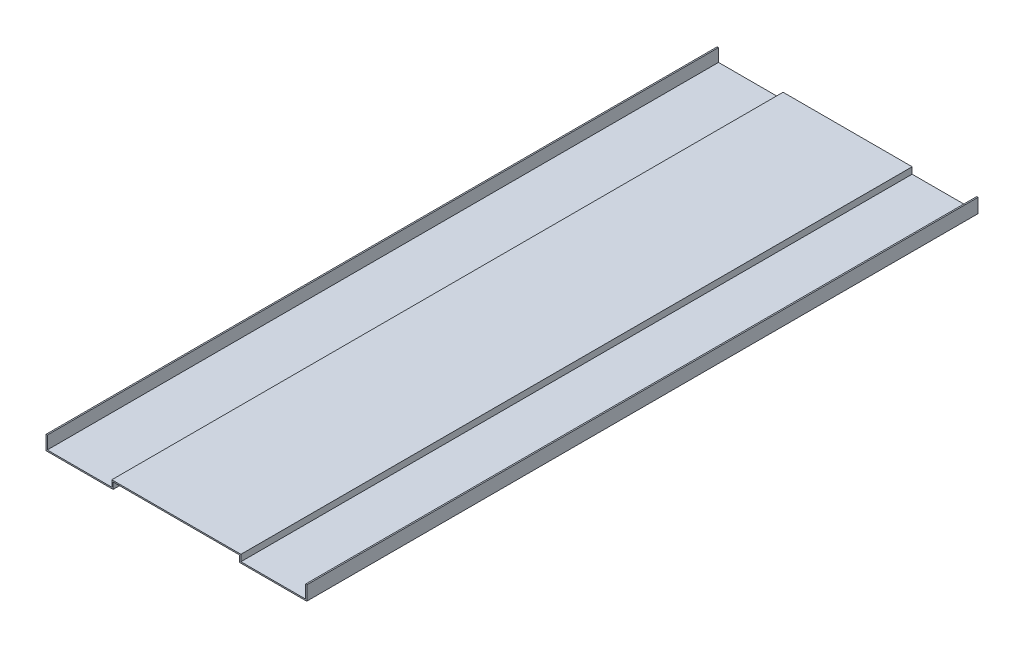
ISO-10303-21;
HEADER;
FILE_DESCRIPTION(('STEP AP214'),'2;1');
FILE_NAME('part.step','',(''),(''),'','','');
FILE_SCHEMA(('AUTOMOTIVE_DESIGN { 1 0 10303 214 1 1 1 1 }'));
ENDSEC;
DATA;
#1=APPLICATION_CONTEXT('core data for automotive mechanical design processes');
#2=APPLICATION_PROTOCOL_DEFINITION('international standard','automotive_design',2000,#1);
#3=PRODUCT_CONTEXT('',#1,'mechanical');
#4=PRODUCT('Part','Part','',(#3));
#5=PRODUCT_RELATED_PRODUCT_CATEGORY('part','',(#4));
#6=PRODUCT_DEFINITION_FORMATION('','',#4);
#7=PRODUCT_DEFINITION_CONTEXT('part definition',#1,'design');
#8=PRODUCT_DEFINITION('design','',#6,#7);
#9=PRODUCT_DEFINITION_SHAPE('','',#8);
#10=(LENGTH_UNIT() NAMED_UNIT(*) SI_UNIT(.MILLI.,.METRE.));
#11=(NAMED_UNIT(*) PLANE_ANGLE_UNIT() SI_UNIT($,.RADIAN.));
#12=(NAMED_UNIT(*) SI_UNIT($,.STERADIAN.) SOLID_ANGLE_UNIT());
#13=UNCERTAINTY_MEASURE_WITH_UNIT(LENGTH_MEASURE(1.E-05),#10,'distance_accuracy_value','');
#14=(GEOMETRIC_REPRESENTATION_CONTEXT(3) GLOBAL_UNCERTAINTY_ASSIGNED_CONTEXT((#13)) GLOBAL_UNIT_ASSIGNED_CONTEXT((#10,
#11,#12)) REPRESENTATION_CONTEXT('',''));
#15=CARTESIAN_POINT('',(0.,0.,0.));
#16=DIRECTION('',(0.,0.,1.));
#17=DIRECTION('',(1.,0.,0.));
#18=AXIS2_PLACEMENT_3D('',#15,#16,#17);
#19=CARTESIAN_POINT('',(-294.943820224719,126.966292134832,5200.));
#20=DIRECTION('',(0.,-1.,0.));
#21=DIRECTION('',(0.,0.,-1.));
#22=AXIS2_PLACEMENT_3D('',#19,#20,#21);
#23=PLANE('',#22);
#24=DIRECTION('',(-1.,0.,0.));
#25=VECTOR('',#24,1.);
#26=CARTESIAN_POINT('',(1755.05617977528,126.966292134832,5200.));
#27=LINE('',#26,#25);
#28=CARTESIAN_POINT('',(-244.943820224719,126.966292134832,5200.));
#29=VERTEX_POINT('',#28);
#30=CARTESIAN_POINT('',(-254.943820224719,126.966292134832,5200.));
#31=VERTEX_POINT('',#30);
#32=EDGE_CURVE('E11',#29,#31,#27,.T.);
#33=ORIENTED_EDGE('',*,*,#32,.F.);
#34=DIRECTION('',(0.,0.,-1.));
#35=VECTOR('',#34,1.);
#36=CARTESIAN_POINT('',(-244.943820224719,126.966292134832,5200.));
#37=LINE('',#36,#35);
#38=CARTESIAN_POINT('',(-244.943820224719,126.966292134832,0.));
#39=VERTEX_POINT('',#38);
#40=EDGE_CURVE('E58',#29,#39,#37,.T.);
#41=ORIENTED_EDGE('',*,*,#40,.T.);
#42=DIRECTION('',(-1.,0.,0.));
#43=VECTOR('',#42,1.);
#44=CARTESIAN_POINT('',(-294.943820224719,126.966292134832,0.));
#45=LINE('',#44,#43);
#46=CARTESIAN_POINT('',(-254.943820224719,126.966292134832,0.));
#47=VERTEX_POINT('',#46);
#48=EDGE_CURVE('E306',#39,#47,#45,.T.);
#49=ORIENTED_EDGE('',*,*,#48,.T.);
#50=DIRECTION('',(0.,0.,1.));
#51=VECTOR('',#50,1.);
#52=CARTESIAN_POINT('',(-254.943820224719,126.966292134832,5200.));
#53=LINE('',#52,#51);
#54=EDGE_CURVE('E289',#47,#31,#53,.T.);
#55=ORIENTED_EDGE('',*,*,#54,.T.);
#56=EDGE_LOOP('',(#33,#41,#49,#55));
#57=FACE_BOUND('',#56,.T.);
#58=ADVANCED_FACE('F40',(#57),#23,.F.);
#59=CARTESIAN_POINT('',(-254.943820224719,116.966292134832,5200.));
#60=DIRECTION('',(1.,0.,0.));
#61=DIRECTION('',(0.,0.,-1.));
#62=AXIS2_PLACEMENT_3D('',#59,#60,#61);
#63=PLANE('',#62);
#64=DIRECTION('',(0.,0.,-1.));
#65=VECTOR('',#64,1.);
#66=CARTESIAN_POINT('',(-254.943820224719,16.9662921348315,5200.));
#67=LINE('',#66,#65);
#68=CARTESIAN_POINT('',(-254.943820224719,16.9662921348315,5200.));
#69=VERTEX_POINT('',#68);
#70=CARTESIAN_POINT('',(-254.943820224719,16.9662921348315,0.));
#71=VERTEX_POINT('',#70);
#72=EDGE_CURVE('E294',#69,#71,#67,.T.);
#73=ORIENTED_EDGE('',*,*,#72,.F.);
#74=DIRECTION('',(0.,-1.,0.));
#75=VECTOR('',#74,1.);
#76=CARTESIAN_POINT('',(-254.943820224719,116.966292134832,5200.));
#77=LINE('',#76,#75);
#78=EDGE_CURVE('E44',#31,#69,#77,.T.);
#79=ORIENTED_EDGE('',*,*,#78,.F.);
#80=ORIENTED_EDGE('',*,*,#54,.F.);
#81=DIRECTION('',(0.,-1.,0.));
#82=VECTOR('',#81,1.);
#83=CARTESIAN_POINT('',(-254.943820224719,116.966292134832,0.));
#84=LINE('',#83,#82);
#85=EDGE_CURVE('E66',#47,#71,#84,.T.);
#86=ORIENTED_EDGE('',*,*,#85,.T.);
#87=EDGE_LOOP('',(#73,#79,#80,#86));
#88=FACE_BOUND('',#87,.T.);
#89=ADVANCED_FACE('F327',(#88),#63,.F.);
#90=CARTESIAN_POINT('',(1245.05617977528,16.9662921348315,5200.));
#91=DIRECTION('',(0.,1.,0.));
#92=DIRECTION('',(0.,0.,1.));
#93=AXIS2_PLACEMENT_3D('',#90,#91,#92);
#94=PLANE('',#93);
#95=DIRECTION('',(1.,0.,0.));
#96=VECTOR('',#95,1.);
#97=CARTESIAN_POINT('',(-254.943820224719,16.9662921348315,0.));
#98=LINE('',#97,#96);
#99=CARTESIAN_POINT('',(265.056179775281,16.9662921348315,0.));
#100=VERTEX_POINT('',#99);
#101=EDGE_CURVE('E298',#71,#100,#98,.T.);
#102=ORIENTED_EDGE('',*,*,#101,.T.);
#103=DIRECTION('',(0.,0.,-1.));
#104=VECTOR('',#103,1.);
#105=CARTESIAN_POINT('',(265.056179775281,16.9662921348315,5200.));
#106=LINE('',#105,#104);
#107=CARTESIAN_POINT('',(265.056179775281,16.9662921348315,1495.));
#108=VERTEX_POINT('',#107);
#109=EDGE_CURVE('E288',#108,#100,#106,.T.);
#110=ORIENTED_EDGE('',*,*,#109,.F.);
#111=DIRECTION('',(-1.,0.,0.));
#112=VECTOR('',#111,1.);
#113=CARTESIAN_POINT('',(1245.05617977528,16.9662921348315,1495.));
#114=LINE('',#113,#112);
#115=CARTESIAN_POINT('',(1245.05617977528,16.9662921348315,1495.));
#116=VERTEX_POINT('',#115);
#117=EDGE_CURVE('E360',#116,#108,#114,.T.);
#118=ORIENTED_EDGE('',*,*,#117,.F.);
#119=DIRECTION('',(0.,0.,-1.));
#120=VECTOR('',#119,1.);
#121=CARTESIAN_POINT('',(1245.05617977528,16.9662921348315,5200.));
#122=LINE('',#121,#120);
#123=CARTESIAN_POINT('',(1245.05617977528,16.9662921348315,0.));
#124=VERTEX_POINT('',#123);
#125=EDGE_CURVE('E270',#116,#124,#122,.T.);
#126=ORIENTED_EDGE('',*,*,#125,.T.);
#127=DIRECTION('',(1.,0.,0.));
#128=VECTOR('',#127,1.);
#129=CARTESIAN_POINT('',(1245.05617977528,16.9662921348315,0.));
#130=LINE('',#129,#128);
#131=CARTESIAN_POINT('',(1765.05617977528,16.9662921348315,0.));
#132=VERTEX_POINT('',#131);
#133=EDGE_CURVE('E227',#124,#132,#130,.T.);
#134=ORIENTED_EDGE('',*,*,#133,.T.);
#135=DIRECTION('',(0.,0.,-1.));
#136=VECTOR('',#135,1.);
#137=CARTESIAN_POINT('',(1765.05617977528,16.9662921348315,5200.));
#138=LINE('',#137,#136);
#139=CARTESIAN_POINT('',(1765.05617977528,16.9662921348315,5200.));
#140=VERTEX_POINT('',#139);
#141=EDGE_CURVE('E216',#140,#132,#138,.T.);
#142=ORIENTED_EDGE('',*,*,#141,.F.);
#143=DIRECTION('',(1.,0.,0.));
#144=VECTOR('',#143,1.);
#145=CARTESIAN_POINT('',(1245.05617977528,16.9662921348315,5200.));
#146=LINE('',#145,#144);
#147=CARTESIAN_POINT('',(1245.05617977528,16.9662921348315,5200.));
#148=VERTEX_POINT('',#147);
#149=EDGE_CURVE('E357',#148,#140,#146,.T.);
#150=ORIENTED_EDGE('',*,*,#149,.F.);
#151=CARTESIAN_POINT('',(1245.05617977528,16.9662921348315,3505.));
#152=VERTEX_POINT('',#151);
#153=EDGE_CURVE('E263',#148,#152,#122,.T.);
#154=ORIENTED_EDGE('',*,*,#153,.T.);
#155=DIRECTION('',(-1.,0.,0.));
#156=VECTOR('',#155,1.);
#157=CARTESIAN_POINT('',(1245.05617977528,16.9662921348315,3505.));
#158=LINE('',#157,#156);
#159=CARTESIAN_POINT('',(265.056179775281,16.9662921348315,3505.));
#160=VERTEX_POINT('',#159);
#161=EDGE_CURVE('E268',#152,#160,#158,.T.);
#162=ORIENTED_EDGE('',*,*,#161,.T.);
#163=CARTESIAN_POINT('',(265.056179775281,16.9662921348315,5200.));
#164=VERTEX_POINT('',#163);
#165=EDGE_CURVE('E282',#164,#160,#106,.T.);
#166=ORIENTED_EDGE('',*,*,#165,.F.);
#167=DIRECTION('',(1.,0.,0.));
#168=VECTOR('',#167,1.);
#169=CARTESIAN_POINT('',(-254.943820224719,16.9662921348315,5200.));
#170=LINE('',#169,#168);
#171=EDGE_CURVE('E50',#69,#164,#170,.T.);
#172=ORIENTED_EDGE('',*,*,#171,.F.);
#173=ORIENTED_EDGE('',*,*,#72,.T.);
#174=EDGE_LOOP('',(#102,#110,#118,#126,#134,#142,#150,#154,#162,#166,#172,#173));
#175=FACE_BOUND('',#174,.T.);
#176=DIRECTION('',(-1.,0.,0.));
#177=VECTOR('',#176,1.);
#178=CARTESIAN_POINT('',(1245.05617977528,16.9662921348315,3495.));
#179=LINE('',#178,#177);
#180=CARTESIAN_POINT('',(1245.05617977528,16.9662921348315,3495.));
#181=VERTEX_POINT('',#180);
#182=CARTESIAN_POINT('',(265.056179775281,16.9662921348315,3495.));
#183=VERTEX_POINT('',#182);
#184=EDGE_CURVE('E435',#181,#183,#179,.T.);
#185=ORIENTED_EDGE('',*,*,#184,.F.);
#186=CARTESIAN_POINT('',(1245.05617977528,16.9662921348315,1505.));
#187=VERTEX_POINT('',#186);
#188=EDGE_CURVE('E269',#181,#187,#122,.T.);
#189=ORIENTED_EDGE('',*,*,#188,.T.);
#190=DIRECTION('',(-1.,0.,0.));
#191=VECTOR('',#190,1.);
#192=CARTESIAN_POINT('',(1245.05617977528,16.9662921348315,1505.));
#193=LINE('',#192,#191);
#194=CARTESIAN_POINT('',(265.056179775281,16.9662921348315,1505.));
#195=VERTEX_POINT('',#194);
#196=EDGE_CURVE('E267',#187,#195,#193,.T.);
#197=ORIENTED_EDGE('',*,*,#196,.T.);
#198=EDGE_CURVE('E276',#183,#195,#106,.T.);
#199=ORIENTED_EDGE('',*,*,#198,.F.);
#200=EDGE_LOOP('',(#185,#189,#197,#199));
#201=FACE_BOUND('',#200,.T.);
#202=ADVANCED_FACE('F329',(#175,#201),#94,.F.);
#203=CARTESIAN_POINT('',(0.,0.,0.));
#204=DIRECTION('',(0.,0.,-1.));
#205=DIRECTION('',(-1.,0.,0.));
#206=AXIS2_PLACEMENT_3D('',#203,#204,#205);
#207=PLANE('',#206);
#208=DIRECTION('',(0.,1.,0.));
#209=VECTOR('',#208,1.);
#210=CARTESIAN_POINT('',(-244.943820224719,126.966292134832,0.));
#211=LINE('',#210,#209);
#212=CARTESIAN_POINT('',(-244.943820224719,26.9662921348315,0.));
#213=VERTEX_POINT('',#212);
#214=EDGE_CURVE('E302',#213,#39,#211,.T.);
#215=ORIENTED_EDGE('',*,*,#214,.F.);
#216=DIRECTION('',(-1.,0.,0.));
#217=VECTOR('',#216,1.);
#218=CARTESIAN_POINT('',(-244.943820224719,26.9662921348315,0.));
#219=LINE('',#218,#217);
#220=CARTESIAN_POINT('',(255.056179775281,26.9662921348315,0.));
#221=VERTEX_POINT('',#220);
#222=EDGE_CURVE('E253',#221,#213,#219,.T.);
#223=ORIENTED_EDGE('',*,*,#222,.F.);
#224=DIRECTION('',(0.,-1.,0.));
#225=VECTOR('',#224,1.);
#226=CARTESIAN_POINT('',(255.056179775281,26.9662921348315,0.));
#227=LINE('',#226,#225);
#228=CARTESIAN_POINT('',(255.056179775281,76.9662921348315,0.));
#229=VERTEX_POINT('',#228);
#230=EDGE_CURVE('E248',#229,#221,#227,.T.);
#231=ORIENTED_EDGE('',*,*,#230,.F.);
#232=DIRECTION('',(-1.,0.,0.));
#233=VECTOR('',#232,1.);
#234=CARTESIAN_POINT('',(255.056179775281,76.9662921348315,0.));
#235=LINE('',#234,#233);
#236=CARTESIAN_POINT('',(1255.05617977528,76.9662921348315,0.));
#237=VERTEX_POINT('',#236);
#238=EDGE_CURVE('E244',#237,#229,#235,.T.);
#239=ORIENTED_EDGE('',*,*,#238,.F.);
#240=DIRECTION('',(0.,1.,0.));
#241=VECTOR('',#240,1.);
#242=CARTESIAN_POINT('',(1255.05617977528,76.9662921348315,0.));
#243=LINE('',#242,#241);
#244=CARTESIAN_POINT('',(1255.05617977528,26.9662921348315,0.));
#245=VERTEX_POINT('',#244);
#246=EDGE_CURVE('E232',#245,#237,#243,.T.);
#247=ORIENTED_EDGE('',*,*,#246,.F.);
#248=DIRECTION('',(-1.,0.,0.));
#249=VECTOR('',#248,1.);
#250=CARTESIAN_POINT('',(1255.05617977528,26.9662921348315,0.));
#251=LINE('',#250,#249);
#252=CARTESIAN_POINT('',(1755.05617977528,26.9662921348315,0.));
#253=VERTEX_POINT('',#252);
#254=EDGE_CURVE('E223',#253,#245,#251,.T.);
#255=ORIENTED_EDGE('',*,*,#254,.F.);
#256=DIRECTION('',(0.,-1.,0.));
#257=VECTOR('',#256,1.);
#258=CARTESIAN_POINT('',(1755.05617977528,26.9662921348315,0.));
#259=LINE('',#258,#257);
#260=CARTESIAN_POINT('',(1755.05617977528,126.966292134832,0.));
#261=VERTEX_POINT('',#260);
#262=EDGE_CURVE('E204',#261,#253,#259,.T.);
#263=ORIENTED_EDGE('',*,*,#262,.F.);
#264=DIRECTION('',(-1.,0.,0.));
#265=VECTOR('',#264,1.);
#266=CARTESIAN_POINT('',(1755.05617977528,126.966292134832,0.));
#267=LINE('',#266,#265);
#268=CARTESIAN_POINT('',(1765.05617977528,126.966292134832,0.));
#269=VERTEX_POINT('',#268);
#270=EDGE_CURVE('E410',#269,#261,#267,.T.);
#271=ORIENTED_EDGE('',*,*,#270,.F.);
#272=DIRECTION('',(0.,1.,0.));
#273=VECTOR('',#272,1.);
#274=CARTESIAN_POINT('',(1765.05617977528,16.9662921348315,0.));
#275=LINE('',#274,#273);
#276=EDGE_CURVE('E405',#132,#269,#275,.T.);
#277=ORIENTED_EDGE('',*,*,#276,.F.);
#278=ORIENTED_EDGE('',*,*,#133,.F.);
#279=DIRECTION('',(0.,-1.,0.));
#280=VECTOR('',#279,1.);
#281=CARTESIAN_POINT('',(1245.05617977528,66.9662921348315,0.));
#282=LINE('',#281,#280);
#283=CARTESIAN_POINT('',(1245.05617977528,66.9662921348315,0.));
#284=VERTEX_POINT('',#283);
#285=EDGE_CURVE('E379',#284,#124,#282,.T.);
#286=ORIENTED_EDGE('',*,*,#285,.F.);
#287=DIRECTION('',(1.,0.,0.));
#288=VECTOR('',#287,1.);
#289=CARTESIAN_POINT('',(265.056179775281,66.9662921348315,0.));
#290=LINE('',#289,#288);
#291=CARTESIAN_POINT('',(265.056179775281,66.9662921348315,0.));
#292=VERTEX_POINT('',#291);
#293=EDGE_CURVE('E375',#292,#284,#290,.T.);
#294=ORIENTED_EDGE('',*,*,#293,.F.);
#295=DIRECTION('',(0.,1.,0.));
#296=VECTOR('',#295,1.);
#297=CARTESIAN_POINT('',(265.056179775281,16.9662921348315,0.));
#298=LINE('',#297,#296);
#299=EDGE_CURVE('E371',#100,#292,#298,.T.);
#300=ORIENTED_EDGE('',*,*,#299,.F.);
#301=ORIENTED_EDGE('',*,*,#101,.F.);
#302=ORIENTED_EDGE('',*,*,#85,.F.);
#303=ORIENTED_EDGE('',*,*,#48,.F.);
#304=EDGE_LOOP('',(#215,#223,#231,#239,#247,#255,#263,#271,#277,#278,#286,#294,#300,#301,#302,#303));
#305=FACE_BOUND('',#304,.T.);
#306=ADVANCED_FACE('F42',(#305),#207,.T.);
#307=CARTESIAN_POINT('',(0.,0.,5200.));
#308=DIRECTION('',(0.,0.,-1.));
#309=DIRECTION('',(-1.,0.,0.));
#310=AXIS2_PLACEMENT_3D('',#307,#308,#309);
#311=PLANE('',#310);
#312=DIRECTION('',(0.,1.,0.));
#313=VECTOR('',#312,1.);
#314=CARTESIAN_POINT('',(-244.943820224719,126.966292134832,5200.));
#315=LINE('',#314,#313);
#316=CARTESIAN_POINT('',(-244.943820224719,26.9662921348315,5200.));
#317=VERTEX_POINT('',#316);
#318=EDGE_CURVE('E305',#317,#29,#315,.T.);
#319=ORIENTED_EDGE('',*,*,#318,.T.);
#320=ORIENTED_EDGE('',*,*,#32,.T.);
#321=ORIENTED_EDGE('',*,*,#78,.T.);
#322=ORIENTED_EDGE('',*,*,#171,.T.);
#323=DIRECTION('',(0.,1.,0.));
#324=VECTOR('',#323,1.);
#325=CARTESIAN_POINT('',(265.056179775281,16.9662921348315,5200.));
#326=LINE('',#325,#324);
#327=CARTESIAN_POINT('',(265.056179775281,66.9662921348315,5200.));
#328=VERTEX_POINT('',#327);
#329=EDGE_CURVE('E337',#164,#328,#326,.T.);
#330=ORIENTED_EDGE('',*,*,#329,.T.);
#331=DIRECTION('',(1.,0.,0.));
#332=VECTOR('',#331,1.);
#333=CARTESIAN_POINT('',(265.056179775281,66.9662921348315,5200.));
#334=LINE('',#333,#332);
#335=CARTESIAN_POINT('',(1245.05617977528,66.9662921348315,5200.));
#336=VERTEX_POINT('',#335);
#337=EDGE_CURVE('E342',#328,#336,#334,.T.);
#338=ORIENTED_EDGE('',*,*,#337,.T.);
#339=DIRECTION('',(0.,-1.,0.));
#340=VECTOR('',#339,1.);
#341=CARTESIAN_POINT('',(1245.05617977528,66.9662921348315,5200.));
#342=LINE('',#341,#340);
#343=EDGE_CURVE('E349',#336,#148,#342,.T.);
#344=ORIENTED_EDGE('',*,*,#343,.T.);
#345=ORIENTED_EDGE('',*,*,#149,.T.);
#346=DIRECTION('',(0.,1.,0.));
#347=VECTOR('',#346,1.);
#348=CARTESIAN_POINT('',(1765.05617977528,16.9662921348315,5200.));
#349=LINE('',#348,#347);
#350=CARTESIAN_POINT('',(1765.05617977528,126.966292134832,5200.));
#351=VERTEX_POINT('',#350);
#352=EDGE_CURVE('E407',#140,#351,#349,.T.);
#353=ORIENTED_EDGE('',*,*,#352,.T.);
#354=DIRECTION('',(-1.,0.,0.));
#355=VECTOR('',#354,1.);
#356=CARTESIAN_POINT('',(1755.05617977528,126.966292134832,5200.));
#357=LINE('',#356,#355);
#358=CARTESIAN_POINT('',(1755.05617977528,126.966292134832,5200.));
#359=VERTEX_POINT('',#358);
#360=EDGE_CURVE('E422',#351,#359,#357,.T.);
#361=ORIENTED_EDGE('',*,*,#360,.T.);
#362=DIRECTION('',(0.,-1.,0.));
#363=VECTOR('',#362,1.);
#364=CARTESIAN_POINT('',(1755.05617977528,26.9662921348315,5200.));
#365=LINE('',#364,#363);
#366=CARTESIAN_POINT('',(1755.05617977528,26.9662921348315,5200.));
#367=VERTEX_POINT('',#366);
#368=EDGE_CURVE('E414',#359,#367,#365,.T.);
#369=ORIENTED_EDGE('',*,*,#368,.T.);
#370=DIRECTION('',(-1.,0.,0.));
#371=VECTOR('',#370,1.);
#372=CARTESIAN_POINT('',(1255.05617977528,26.9662921348315,5200.));
#373=LINE('',#372,#371);
#374=CARTESIAN_POINT('',(1255.05617977528,26.9662921348315,5200.));
#375=VERTEX_POINT('',#374);
#376=EDGE_CURVE('E225',#367,#375,#373,.T.);
#377=ORIENTED_EDGE('',*,*,#376,.T.);
#378=DIRECTION('',(0.,1.,0.));
#379=VECTOR('',#378,1.);
#380=CARTESIAN_POINT('',(1255.05617977528,76.9662921348315,5200.));
#381=LINE('',#380,#379);
#382=CARTESIAN_POINT('',(1255.05617977528,76.9662921348315,5200.));
#383=VERTEX_POINT('',#382);
#384=EDGE_CURVE('E363',#375,#383,#381,.T.);
#385=ORIENTED_EDGE('',*,*,#384,.T.);
#386=DIRECTION('',(-1.,0.,0.));
#387=VECTOR('',#386,1.);
#388=CARTESIAN_POINT('',(255.056179775281,76.9662921348315,5200.));
#389=LINE('',#388,#387);
#390=CARTESIAN_POINT('',(255.056179775281,76.9662921348315,5200.));
#391=VERTEX_POINT('',#390);
#392=EDGE_CURVE('E366',#383,#391,#389,.T.);
#393=ORIENTED_EDGE('',*,*,#392,.T.);
#394=DIRECTION('',(0.,-1.,0.));
#395=VECTOR('',#394,1.);
#396=CARTESIAN_POINT('',(255.056179775281,26.9662921348315,5200.));
#397=LINE('',#396,#395);
#398=CARTESIAN_POINT('',(255.056179775281,26.9662921348315,5200.));
#399=VERTEX_POINT('',#398);
#400=EDGE_CURVE('E347',#391,#399,#397,.T.);
#401=ORIENTED_EDGE('',*,*,#400,.T.);
#402=DIRECTION('',(-1.,0.,0.));
#403=VECTOR('',#402,1.);
#404=CARTESIAN_POINT('',(-244.943820224719,26.9662921348315,5200.));
#405=LINE('',#404,#403);
#406=EDGE_CURVE('E341',#399,#317,#405,.T.);
#407=ORIENTED_EDGE('',*,*,#406,.T.);
#408=EDGE_LOOP('',(#319,#320,#321,#322,#330,#338,#344,#345,#353,#361,#369,#377,#385,#393,#401,#407));
#409=FACE_BOUND('',#408,.T.);
#410=ADVANCED_FACE('F324',(#409),#311,.F.);
#411=CARTESIAN_POINT('',(-244.943820224719,126.966292134832,5200.));
#412=DIRECTION('',(-1.,0.,0.));
#413=DIRECTION('',(0.,-1.,0.));
#414=AXIS2_PLACEMENT_3D('',#411,#412,#413);
#415=PLANE('',#414);
#416=ORIENTED_EDGE('',*,*,#40,.F.);
#417=ORIENTED_EDGE('',*,*,#318,.F.);
#418=DIRECTION('',(0.,0.,-1.));
#419=VECTOR('',#418,1.);
#420=CARTESIAN_POINT('',(-244.943820224719,26.9662921348315,5200.));
#421=LINE('',#420,#419);
#422=EDGE_CURVE('E293',#317,#213,#421,.T.);
#423=ORIENTED_EDGE('',*,*,#422,.T.);
#424=ORIENTED_EDGE('',*,*,#214,.T.);
#425=EDGE_LOOP('',(#416,#417,#423,#424));
#426=FACE_BOUND('',#425,.T.);
#427=ADVANCED_FACE('F505',(#426),#415,.F.);
#428=CARTESIAN_POINT('',(265.056179775281,66.9662921348315,5200.));
#429=DIRECTION('',(0.,1.,0.));
#430=DIRECTION('',(0.,0.,1.));
#431=AXIS2_PLACEMENT_3D('',#428,#429,#430);
#432=PLANE('',#431);
#433=DIRECTION('',(0.,0.,-1.));
#434=VECTOR('',#433,1.);
#435=CARTESIAN_POINT('',(1245.05617977528,66.9662921348315,5200.));
#436=LINE('',#435,#434);
#437=CARTESIAN_POINT('',(1245.05617977528,66.9662921348315,3495.));
#438=VERTEX_POINT('',#437);
#439=CARTESIAN_POINT('',(1245.05617977528,66.9662921348315,1505.));
#440=VERTEX_POINT('',#439);
#441=EDGE_CURVE('E277',#438,#440,#436,.T.);
#442=ORIENTED_EDGE('',*,*,#441,.F.);
#443=DIRECTION('',(-1.,0.,0.));
#444=VECTOR('',#443,1.);
#445=CARTESIAN_POINT('',(265.056179775281,66.9662921348315,3495.));
#446=LINE('',#445,#444);
#447=CARTESIAN_POINT('',(265.056179775281,66.9662921348315,3495.));
#448=VERTEX_POINT('',#447);
#449=EDGE_CURVE('E449',#438,#448,#446,.T.);
#450=ORIENTED_EDGE('',*,*,#449,.T.);
#451=DIRECTION('',(0.,0.,-1.));
#452=VECTOR('',#451,1.);
#453=CARTESIAN_POINT('',(265.056179775281,66.9662921348315,5200.));
#454=LINE('',#453,#452);
#455=CARTESIAN_POINT('',(265.056179775281,66.9662921348315,1505.));
#456=VERTEX_POINT('',#455);
#457=EDGE_CURVE('E283',#448,#456,#454,.T.);
#458=ORIENTED_EDGE('',*,*,#457,.T.);
#459=DIRECTION('',(-1.,0.,0.));
#460=VECTOR('',#459,1.);
#461=CARTESIAN_POINT('',(265.056179775281,66.9662921348315,1505.));
#462=LINE('',#461,#460);
#463=EDGE_CURVE('E440',#440,#456,#462,.T.);
#464=ORIENTED_EDGE('',*,*,#463,.F.);
#465=EDGE_LOOP('',(#442,#450,#458,#464));
#466=FACE_BOUND('',#465,.T.);
#467=ADVANCED_FACE('F477',(#466),#432,.F.);
#468=CARTESIAN_POINT('',(1245.05617977528,16.9662921348315,1495.));
#469=DIRECTION('',(0.,0.,-1.));
#470=DIRECTION('',(-1.,0.,0.));
#471=AXIS2_PLACEMENT_3D('',#468,#469,#470);
#472=PLANE('',#471);
#473=DIRECTION('',(-1.,0.,0.));
#474=VECTOR('',#473,1.);
#475=CARTESIAN_POINT('',(265.056179775281,66.9662921348315,1495.));
#476=LINE('',#475,#474);
#477=CARTESIAN_POINT('',(1245.05617977528,66.9662921348315,1495.));
#478=VERTEX_POINT('',#477);
#479=CARTESIAN_POINT('',(265.056179775281,66.9662921348315,1495.));
#480=VERTEX_POINT('',#479);
#481=EDGE_CURVE('E352',#478,#480,#476,.T.);
#482=ORIENTED_EDGE('',*,*,#481,.F.);
#483=DIRECTION('',(0.,1.,0.));
#484=VECTOR('',#483,1.);
#485=CARTESIAN_POINT('',(1245.05617977528,16.9662921348315,1495.));
#486=LINE('',#485,#484);
#487=EDGE_CURVE('E378',#116,#478,#486,.T.);
#488=ORIENTED_EDGE('',*,*,#487,.F.);
#489=ORIENTED_EDGE('',*,*,#117,.T.);
#490=DIRECTION('',(0.,1.,0.));
#491=VECTOR('',#490,1.);
#492=CARTESIAN_POINT('',(265.056179775281,16.9662921348315,1495.));
#493=LINE('',#492,#491);
#494=EDGE_CURVE('E455',#108,#480,#493,.T.);
#495=ORIENTED_EDGE('',*,*,#494,.T.);
#496=EDGE_LOOP('',(#482,#488,#489,#495));
#497=FACE_BOUND('',#496,.T.);
#498=ADVANCED_FACE('F546',(#497),#472,.T.);
#499=CARTESIAN_POINT('',(1245.05617977528,16.9662921348315,3505.));
#500=DIRECTION('',(0.,0.,-1.));
#501=DIRECTION('',(-1.,0.,0.));
#502=AXIS2_PLACEMENT_3D('',#499,#500,#501);
#503=PLANE('',#502);
#504=DIRECTION('',(0.,1.,0.));
#505=VECTOR('',#504,1.);
#506=CARTESIAN_POINT('',(1245.05617977528,16.9662921348315,3505.));
#507=LINE('',#506,#505);
#508=CARTESIAN_POINT('',(1245.05617977528,66.9662921348315,3505.));
#509=VERTEX_POINT('',#508);
#510=EDGE_CURVE('E436',#152,#509,#507,.T.);
#511=ORIENTED_EDGE('',*,*,#510,.T.);
#512=DIRECTION('',(-1.,0.,0.));
#513=VECTOR('',#512,1.);
#514=CARTESIAN_POINT('',(265.056179775281,66.9662921348315,3505.));
#515=LINE('',#514,#513);
#516=CARTESIAN_POINT('',(265.056179775281,66.9662921348315,3505.));
#517=VERTEX_POINT('',#516);
#518=EDGE_CURVE('E421',#509,#517,#515,.T.);
#519=ORIENTED_EDGE('',*,*,#518,.T.);
#520=DIRECTION('',(0.,1.,0.));
#521=VECTOR('',#520,1.);
#522=CARTESIAN_POINT('',(265.056179775281,16.9662921348315,3505.));
#523=LINE('',#522,#521);
#524=EDGE_CURVE('E287',#160,#517,#523,.T.);
#525=ORIENTED_EDGE('',*,*,#524,.F.);
#526=ORIENTED_EDGE('',*,*,#161,.F.);
#527=EDGE_LOOP('',(#511,#519,#525,#526));
#528=FACE_BOUND('',#527,.T.);
#529=ADVANCED_FACE('F553',(#528),#503,.F.);
#530=CARTESIAN_POINT('',(265.056179775281,16.9662921348315,5200.));
#531=DIRECTION('',(-1.,0.,0.));
#532=DIRECTION('',(0.,0.,1.));
#533=AXIS2_PLACEMENT_3D('',#530,#531,#532);
#534=PLANE('',#533);
#535=ORIENTED_EDGE('',*,*,#457,.F.);
#536=DIRECTION('',(0.,1.,0.));
#537=VECTOR('',#536,1.);
#538=CARTESIAN_POINT('',(265.056179775281,16.9662921348315,3495.));
#539=LINE('',#538,#537);
#540=EDGE_CURVE('E431',#183,#448,#539,.T.);
#541=ORIENTED_EDGE('',*,*,#540,.F.);
#542=ORIENTED_EDGE('',*,*,#198,.T.);
#543=DIRECTION('',(0.,1.,0.));
#544=VECTOR('',#543,1.);
#545=CARTESIAN_POINT('',(265.056179775281,16.9662921348315,1505.));
#546=LINE('',#545,#544);
#547=EDGE_CURVE('E452',#195,#456,#546,.T.);
#548=ORIENTED_EDGE('',*,*,#547,.T.);
#549=EDGE_LOOP('',(#535,#541,#542,#548));
#550=FACE_BOUND('',#549,.T.);
#551=ADVANCED_FACE('F482',(#550),#534,.F.);
#552=CARTESIAN_POINT('',(1245.05617977528,16.9662921348315,1505.));
#553=DIRECTION('',(0.,0.,-1.));
#554=DIRECTION('',(-1.,0.,0.));
#555=AXIS2_PLACEMENT_3D('',#552,#553,#554);
#556=PLANE('',#555);
#557=DIRECTION('',(0.,1.,0.));
#558=VECTOR('',#557,1.);
#559=CARTESIAN_POINT('',(1245.05617977528,16.9662921348315,1505.));
#560=LINE('',#559,#558);
#561=EDGE_CURVE('E459',#187,#440,#560,.T.);
#562=ORIENTED_EDGE('',*,*,#561,.T.);
#563=ORIENTED_EDGE('',*,*,#463,.T.);
#564=ORIENTED_EDGE('',*,*,#547,.F.);
#565=ORIENTED_EDGE('',*,*,#196,.F.);
#566=EDGE_LOOP('',(#562,#563,#564,#565));
#567=FACE_BOUND('',#566,.T.);
#568=ADVANCED_FACE('F473',(#567),#556,.F.);
#569=CARTESIAN_POINT('',(1245.05617977528,66.9662921348315,5200.));
#570=DIRECTION('',(1.,0.,0.));
#571=DIRECTION('',(0.,0.,-1.));
#572=AXIS2_PLACEMENT_3D('',#569,#570,#571);
#573=PLANE('',#572);
#574=ORIENTED_EDGE('',*,*,#188,.F.);
#575=DIRECTION('',(0.,1.,0.));
#576=VECTOR('',#575,1.);
#577=CARTESIAN_POINT('',(1245.05617977528,16.9662921348315,3495.));
#578=LINE('',#577,#576);
#579=EDGE_CURVE('E428',#181,#438,#578,.T.);
#580=ORIENTED_EDGE('',*,*,#579,.T.);
#581=ORIENTED_EDGE('',*,*,#441,.T.);
#582=ORIENTED_EDGE('',*,*,#561,.F.);
#583=EDGE_LOOP('',(#574,#580,#581,#582));
#584=FACE_BOUND('',#583,.T.);
#585=ADVANCED_FACE('F492',(#584),#573,.F.);
#586=CARTESIAN_POINT('',(1245.05617977528,16.9662921348315,3495.));
#587=DIRECTION('',(0.,0.,-1.));
#588=DIRECTION('',(-1.,0.,0.));
#589=AXIS2_PLACEMENT_3D('',#586,#587,#588);
#590=PLANE('',#589);
#591=ORIENTED_EDGE('',*,*,#449,.F.);
#592=ORIENTED_EDGE('',*,*,#579,.F.);
#593=ORIENTED_EDGE('',*,*,#184,.T.);
#594=ORIENTED_EDGE('',*,*,#540,.T.);
#595=EDGE_LOOP('',(#591,#592,#593,#594));
#596=FACE_BOUND('',#595,.T.);
#597=ADVANCED_FACE('F495',(#596),#590,.T.);
#598=ORIENTED_EDGE('',*,*,#510,.F.);
#599=ORIENTED_EDGE('',*,*,#153,.F.);
#600=ORIENTED_EDGE('',*,*,#343,.F.);
#601=EDGE_CURVE('E271',#336,#509,#436,.T.);
#602=ORIENTED_EDGE('',*,*,#601,.T.);
#603=EDGE_LOOP('',(#598,#599,#600,#602));
#604=FACE_BOUND('',#603,.T.);
#605=ADVANCED_FACE('F562',(#604),#573,.F.);
#606=ORIENTED_EDGE('',*,*,#518,.F.);
#607=ORIENTED_EDGE('',*,*,#601,.F.);
#608=ORIENTED_EDGE('',*,*,#337,.F.);
#609=EDGE_CURVE('E275',#328,#517,#454,.T.);
#610=ORIENTED_EDGE('',*,*,#609,.T.);
#611=EDGE_LOOP('',(#606,#607,#608,#610));
#612=FACE_BOUND('',#611,.T.);
#613=ADVANCED_FACE('F549',(#612),#432,.F.);
#614=ORIENTED_EDGE('',*,*,#524,.T.);
#615=ORIENTED_EDGE('',*,*,#609,.F.);
#616=ORIENTED_EDGE('',*,*,#329,.F.);
#617=ORIENTED_EDGE('',*,*,#165,.T.);
#618=EDGE_LOOP('',(#614,#615,#616,#617));
#619=FACE_BOUND('',#618,.T.);
#620=ADVANCED_FACE('F338',(#619),#534,.F.);
#621=CARTESIAN_POINT('',(1255.05617977528,26.9662921348315,5200.));
#622=DIRECTION('',(0.,-1.,0.));
#623=DIRECTION('',(1.,0.,0.));
#624=AXIS2_PLACEMENT_3D('',#621,#622,#623);
#625=PLANE('',#624);
#626=DIRECTION('',(0.,0.,-1.));
#627=VECTOR('',#626,1.);
#628=CARTESIAN_POINT('',(1755.05617977528,26.9662921348315,5200.));
#629=LINE('',#628,#627);
#630=EDGE_CURVE('E207',#367,#253,#629,.T.);
#631=ORIENTED_EDGE('',*,*,#630,.T.);
#632=ORIENTED_EDGE('',*,*,#254,.T.);
#633=DIRECTION('',(0.,0.,-1.));
#634=VECTOR('',#633,1.);
#635=CARTESIAN_POINT('',(1255.05617977528,26.9662921348315,5200.));
#636=LINE('',#635,#634);
#637=EDGE_CURVE('E234',#375,#245,#636,.T.);
#638=ORIENTED_EDGE('',*,*,#637,.F.);
#639=ORIENTED_EDGE('',*,*,#376,.F.);
#640=EDGE_LOOP('',(#631,#632,#638,#639));
#641=FACE_BOUND('',#640,.T.);
#642=ADVANCED_FACE('F221',(#641),#625,.F.);
#643=CARTESIAN_POINT('',(1255.05617977528,76.9662921348315,5200.));
#644=DIRECTION('',(-1.,0.,0.));
#645=DIRECTION('',(0.,0.,1.));
#646=AXIS2_PLACEMENT_3D('',#643,#644,#645);
#647=PLANE('',#646);
#648=ORIENTED_EDGE('',*,*,#637,.T.);
#649=ORIENTED_EDGE('',*,*,#246,.T.);
#650=DIRECTION('',(0.,0.,-1.));
#651=VECTOR('',#650,1.);
#652=CARTESIAN_POINT('',(1255.05617977528,76.9662921348315,5200.));
#653=LINE('',#652,#651);
#654=EDGE_CURVE('E243',#383,#237,#653,.T.);
#655=ORIENTED_EDGE('',*,*,#654,.F.);
#656=ORIENTED_EDGE('',*,*,#384,.F.);
#657=EDGE_LOOP('',(#648,#649,#655,#656));
#658=FACE_BOUND('',#657,.T.);
#659=ADVANCED_FACE('F531',(#658),#647,.F.);
#660=CARTESIAN_POINT('',(255.056179775281,76.9662921348315,5200.));
#661=DIRECTION('',(0.,-1.,0.));
#662=DIRECTION('',(0.,0.,-1.));
#663=AXIS2_PLACEMENT_3D('',#660,#661,#662);
#664=PLANE('',#663);
#665=ORIENTED_EDGE('',*,*,#654,.T.);
#666=ORIENTED_EDGE('',*,*,#238,.T.);
#667=DIRECTION('',(0.,0.,-1.));
#668=VECTOR('',#667,1.);
#669=CARTESIAN_POINT('',(255.056179775281,76.9662921348315,5200.));
#670=LINE('',#669,#668);
#671=EDGE_CURVE('E252',#391,#229,#670,.T.);
#672=ORIENTED_EDGE('',*,*,#671,.F.);
#673=ORIENTED_EDGE('',*,*,#392,.F.);
#674=EDGE_LOOP('',(#665,#666,#672,#673));
#675=FACE_BOUND('',#674,.T.);
#676=ADVANCED_FACE('F527',(#675),#664,.F.);
#677=CARTESIAN_POINT('',(255.056179775281,26.9662921348315,5200.));
#678=DIRECTION('',(1.,0.,0.));
#679=DIRECTION('',(0.,0.,-1.));
#680=AXIS2_PLACEMENT_3D('',#677,#678,#679);
#681=PLANE('',#680);
#682=ORIENTED_EDGE('',*,*,#230,.T.);
#683=DIRECTION('',(0.,0.,-1.));
#684=VECTOR('',#683,1.);
#685=CARTESIAN_POINT('',(255.056179775281,26.9662921348315,5200.));
#686=LINE('',#685,#684);
#687=EDGE_CURVE('E256',#399,#221,#686,.T.);
#688=ORIENTED_EDGE('',*,*,#687,.F.);
#689=ORIENTED_EDGE('',*,*,#400,.F.);
#690=ORIENTED_EDGE('',*,*,#671,.T.);
#691=EDGE_LOOP('',(#682,#688,#689,#690));
#692=FACE_BOUND('',#691,.T.);
#693=ADVANCED_FACE('F525',(#692),#681,.F.);
#694=CARTESIAN_POINT('',(-244.943820224719,26.9662921348315,5200.));
#695=DIRECTION('',(0.,-1.,0.));
#696=DIRECTION('',(0.,0.,-1.));
#697=AXIS2_PLACEMENT_3D('',#694,#695,#696);
#698=PLANE('',#697);
#699=ORIENTED_EDGE('',*,*,#222,.T.);
#700=ORIENTED_EDGE('',*,*,#422,.F.);
#701=ORIENTED_EDGE('',*,*,#406,.F.);
#702=ORIENTED_EDGE('',*,*,#687,.T.);
#703=EDGE_LOOP('',(#699,#700,#701,#702));
#704=FACE_BOUND('',#703,.T.);
#705=ADVANCED_FACE('F519',(#704),#698,.F.);
#706=EDGE_CURVE('E284',#480,#292,#454,.T.);
#707=ORIENTED_EDGE('',*,*,#706,.F.);
#708=ORIENTED_EDGE('',*,*,#494,.F.);
#709=ORIENTED_EDGE('',*,*,#109,.T.);
#710=ORIENTED_EDGE('',*,*,#299,.T.);
#711=EDGE_LOOP('',(#707,#708,#709,#710));
#712=FACE_BOUND('',#711,.T.);
#713=ADVANCED_FACE('F559',(#712),#534,.F.);
#714=EDGE_CURVE('E278',#478,#284,#436,.T.);
#715=ORIENTED_EDGE('',*,*,#714,.F.);
#716=ORIENTED_EDGE('',*,*,#481,.T.);
#717=ORIENTED_EDGE('',*,*,#706,.T.);
#718=ORIENTED_EDGE('',*,*,#293,.T.);
#719=EDGE_LOOP('',(#715,#716,#717,#718));
#720=FACE_BOUND('',#719,.T.);
#721=ADVANCED_FACE('F548',(#720),#432,.F.);
#722=ORIENTED_EDGE('',*,*,#125,.F.);
#723=ORIENTED_EDGE('',*,*,#487,.T.);
#724=ORIENTED_EDGE('',*,*,#714,.T.);
#725=ORIENTED_EDGE('',*,*,#285,.T.);
#726=EDGE_LOOP('',(#722,#723,#724,#725));
#727=FACE_BOUND('',#726,.T.);
#728=ADVANCED_FACE('F509',(#727),#573,.F.);
#729=CARTESIAN_POINT('',(1755.05617977528,106.966292134831,5140.));
#730=DIRECTION('',(-1.,0.,0.));
#731=DIRECTION('',(0.,0.,1.));
#732=AXIS2_PLACEMENT_3D('',#729,#730,#731);
#733=PLANE('',#732);
#734=ORIENTED_EDGE('',*,*,#368,.F.);
#735=DIRECTION('',(0.,0.,-1.));
#736=VECTOR('',#735,1.);
#737=CARTESIAN_POINT('',(1755.05617977528,126.966292134832,5200.));
#738=LINE('',#737,#736);
#739=EDGE_CURVE('E210',#359,#261,#738,.T.);
#740=ORIENTED_EDGE('',*,*,#739,.T.);
#741=ORIENTED_EDGE('',*,*,#262,.T.);
#742=ORIENTED_EDGE('',*,*,#630,.F.);
#743=EDGE_LOOP('',(#734,#740,#741,#742));
#744=FACE_BOUND('',#743,.T.);
#745=ADVANCED_FACE('F206',(#744),#733,.T.);
#746=CARTESIAN_POINT('',(-294.943820224719,126.966292134832,5200.));
#747=DIRECTION('',(0.,-1.,0.));
#748=DIRECTION('',(0.,0.,-1.));
#749=AXIS2_PLACEMENT_3D('',#746,#747,#748);
#750=PLANE('',#749);
#751=ORIENTED_EDGE('',*,*,#739,.F.);
#752=ORIENTED_EDGE('',*,*,#360,.F.);
#753=DIRECTION('',(0.,0.,-1.));
#754=VECTOR('',#753,1.);
#755=CARTESIAN_POINT('',(1765.05617977528,126.966292134832,5200.));
#756=LINE('',#755,#754);
#757=EDGE_CURVE('E215',#351,#269,#756,.T.);
#758=ORIENTED_EDGE('',*,*,#757,.T.);
#759=ORIENTED_EDGE('',*,*,#270,.T.);
#760=EDGE_LOOP('',(#751,#752,#758,#759));
#761=FACE_BOUND('',#760,.T.);
#762=ADVANCED_FACE('F536',(#761),#750,.F.);
#763=CARTESIAN_POINT('',(1765.05617977528,16.9662921348315,5200.));
#764=DIRECTION('',(-1.,0.,0.));
#765=DIRECTION('',(0.,0.,1.));
#766=AXIS2_PLACEMENT_3D('',#763,#764,#765);
#767=PLANE('',#766);
#768=ORIENTED_EDGE('',*,*,#276,.T.);
#769=ORIENTED_EDGE('',*,*,#757,.F.);
#770=ORIENTED_EDGE('',*,*,#352,.F.);
#771=ORIENTED_EDGE('',*,*,#141,.T.);
#772=EDGE_LOOP('',(#768,#769,#770,#771));
#773=FACE_BOUND('',#772,.T.);
#774=ADVANCED_FACE('F403',(#773),#767,.F.);
#775=CLOSED_SHELL('',(#58,#89,#202,#306,#410,#427,#467,#498,#529,#551,#568,#585,#597,#605,#613,
#620,#642,#659,#676,#693,#705,#713,#721,#728,#745,#762,#774));
#776=MANIFOLD_SOLID_BREP('B2',#775);
#777=ADVANCED_BREP_SHAPE_REPRESENTATION('',(#18,#776),#14);
#778=SHAPE_DEFINITION_REPRESENTATION(#9,#777);
ENDSEC;
END-ISO-10303-21;
